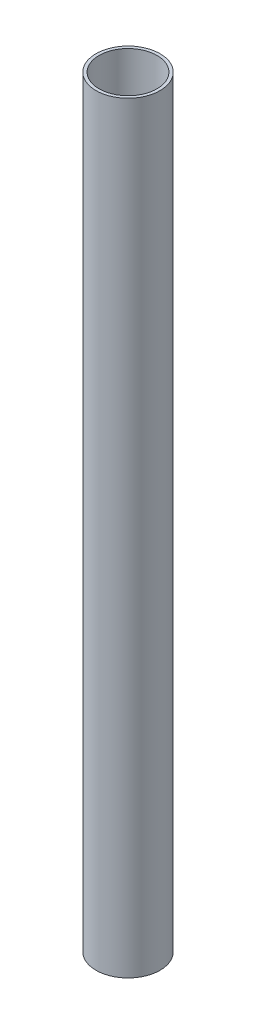
ISO-10303-21;
HEADER;
FILE_DESCRIPTION(('STEP AP214'),'2;1');
FILE_NAME('part.step','',(''),(''),'','','');
FILE_SCHEMA(('AUTOMOTIVE_DESIGN { 1 0 10303 214 1 1 1 1 }'));
ENDSEC;
DATA;
#1=APPLICATION_CONTEXT('core data for automotive mechanical design processes');
#2=APPLICATION_PROTOCOL_DEFINITION('international standard','automotive_design',2000,#1);
#3=PRODUCT_CONTEXT('',#1,'mechanical');
#4=PRODUCT('Part','Part','',(#3));
#5=PRODUCT_RELATED_PRODUCT_CATEGORY('part','',(#4));
#6=PRODUCT_DEFINITION_FORMATION('','',#4);
#7=PRODUCT_DEFINITION_CONTEXT('part definition',#1,'design');
#8=PRODUCT_DEFINITION('design','',#6,#7);
#9=PRODUCT_DEFINITION_SHAPE('','',#8);
#10=(LENGTH_UNIT() NAMED_UNIT(*) SI_UNIT(.MILLI.,.METRE.));
#11=(NAMED_UNIT(*) PLANE_ANGLE_UNIT() SI_UNIT($,.RADIAN.));
#12=(NAMED_UNIT(*) SI_UNIT($,.STERADIAN.) SOLID_ANGLE_UNIT());
#13=UNCERTAINTY_MEASURE_WITH_UNIT(LENGTH_MEASURE(1.E-05),#10,'distance_accuracy_value','');
#14=(GEOMETRIC_REPRESENTATION_CONTEXT(3) GLOBAL_UNCERTAINTY_ASSIGNED_CONTEXT((#13)) GLOBAL_UNIT_ASSIGNED_CONTEXT((#10,
#11,#12)) REPRESENTATION_CONTEXT('',''));
#15=CARTESIAN_POINT('',(0.,0.,0.));
#16=DIRECTION('',(0.,0.,1.));
#17=DIRECTION('',(1.,0.,0.));
#18=AXIS2_PLACEMENT_3D('',#15,#16,#17);
#19=CARTESIAN_POINT('',(0.,250.,0.));
#20=DIRECTION('',(0.,1.,0.));
#21=DIRECTION('',(0.,0.,1.));
#22=AXIS2_PLACEMENT_3D('',#19,#20,#21);
#23=PLANE('',#22);
#24=CARTESIAN_POINT('',(0.,250.,0.));
#25=DIRECTION('',(0.,1.,0.));
#26=DIRECTION('',(1.,0.,0.));
#27=AXIS2_PLACEMENT_3D('',#24,#25,#26);
#28=CIRCLE('',#27,10.5);
#29=CARTESIAN_POINT('',(10.5,250.,0.));
#30=VERTEX_POINT('',#29);
#31=EDGE_CURVE('E11',#30,#30,#28,.T.);
#32=ORIENTED_EDGE('',*,*,#31,.T.);
#33=EDGE_LOOP('',(#32));
#34=FACE_BOUND('',#33,.T.);
#35=CARTESIAN_POINT('',(0.,250.,0.));
#36=DIRECTION('',(0.,1.,0.));
#37=DIRECTION('',(0.,0.,1.));
#38=AXIS2_PLACEMENT_3D('',#35,#36,#37);
#39=CIRCLE('',#38,9.5);
#40=CARTESIAN_POINT('',(0.,250.,9.5));
#41=VERTEX_POINT('',#40);
#42=EDGE_CURVE('E58',#41,#41,#39,.T.);
#43=ORIENTED_EDGE('',*,*,#42,.F.);
#44=EDGE_LOOP('',(#43));
#45=FACE_BOUND('',#44,.T.);
#46=ADVANCED_FACE('F45',(#34,#45),#23,.T.);
#47=CARTESIAN_POINT('',(0.,0.,0.));
#48=DIRECTION('',(0.,1.,0.));
#49=DIRECTION('',(0.,0.,1.));
#50=AXIS2_PLACEMENT_3D('',#47,#48,#49);
#51=PLANE('',#50);
#52=CARTESIAN_POINT('',(0.,0.,0.));
#53=DIRECTION('',(0.,1.,0.));
#54=DIRECTION('',(1.,0.,0.));
#55=AXIS2_PLACEMENT_3D('',#52,#53,#54);
#56=CIRCLE('',#55,10.5);
#57=CARTESIAN_POINT('',(10.5,0.,0.));
#58=VERTEX_POINT('',#57);
#59=EDGE_CURVE('E49',#58,#58,#56,.T.);
#60=ORIENTED_EDGE('',*,*,#59,.F.);
#61=EDGE_LOOP('',(#60));
#62=FACE_BOUND('',#61,.T.);
#63=CARTESIAN_POINT('',(0.,0.,0.));
#64=DIRECTION('',(0.,1.,0.));
#65=DIRECTION('',(0.,0.,1.));
#66=AXIS2_PLACEMENT_3D('',#63,#64,#65);
#67=CIRCLE('',#66,9.5);
#68=CARTESIAN_POINT('',(0.,0.,9.5));
#69=VERTEX_POINT('',#68);
#70=EDGE_CURVE('E60',#69,#69,#67,.T.);
#71=ORIENTED_EDGE('',*,*,#70,.T.);
#72=EDGE_LOOP('',(#71));
#73=FACE_BOUND('',#72,.T.);
#74=ADVANCED_FACE('F72',(#62,#73),#51,.F.);
#75=CARTESIAN_POINT('',(0.,250.,0.));
#76=DIRECTION('',(0.,-1.,0.));
#77=DIRECTION('',(0.,0.,-1.));
#78=AXIS2_PLACEMENT_3D('',#75,#76,#77);
#79=CYLINDRICAL_SURFACE('',#78,10.5);
#80=ORIENTED_EDGE('',*,*,#31,.F.);
#81=EDGE_LOOP('',(#80));
#82=FACE_BOUND('',#81,.T.);
#83=ORIENTED_EDGE('',*,*,#59,.T.);
#84=EDGE_LOOP('',(#83));
#85=FACE_BOUND('',#84,.T.);
#86=ADVANCED_FACE('F47',(#82,#85),#79,.T.);
#87=CARTESIAN_POINT('',(0.,250.,0.));
#88=DIRECTION('',(0.,-1.,0.));
#89=DIRECTION('',(0.,0.,-1.));
#90=AXIS2_PLACEMENT_3D('',#87,#88,#89);
#91=CYLINDRICAL_SURFACE('',#90,9.5);
#92=ORIENTED_EDGE('',*,*,#42,.T.);
#93=EDGE_LOOP('',(#92));
#94=FACE_BOUND('',#93,.T.);
#95=ORIENTED_EDGE('',*,*,#70,.F.);
#96=EDGE_LOOP('',(#95));
#97=FACE_BOUND('',#96,.T.);
#98=ADVANCED_FACE('F68',(#94,#97),#91,.F.);
#99=CLOSED_SHELL('',(#46,#74,#86,#98));
#100=MANIFOLD_SOLID_BREP('B2',#99);
#101=ADVANCED_BREP_SHAPE_REPRESENTATION('',(#18,#100),#14);
#102=SHAPE_DEFINITION_REPRESENTATION(#9,#101);
ENDSEC;
END-ISO-10303-21;
